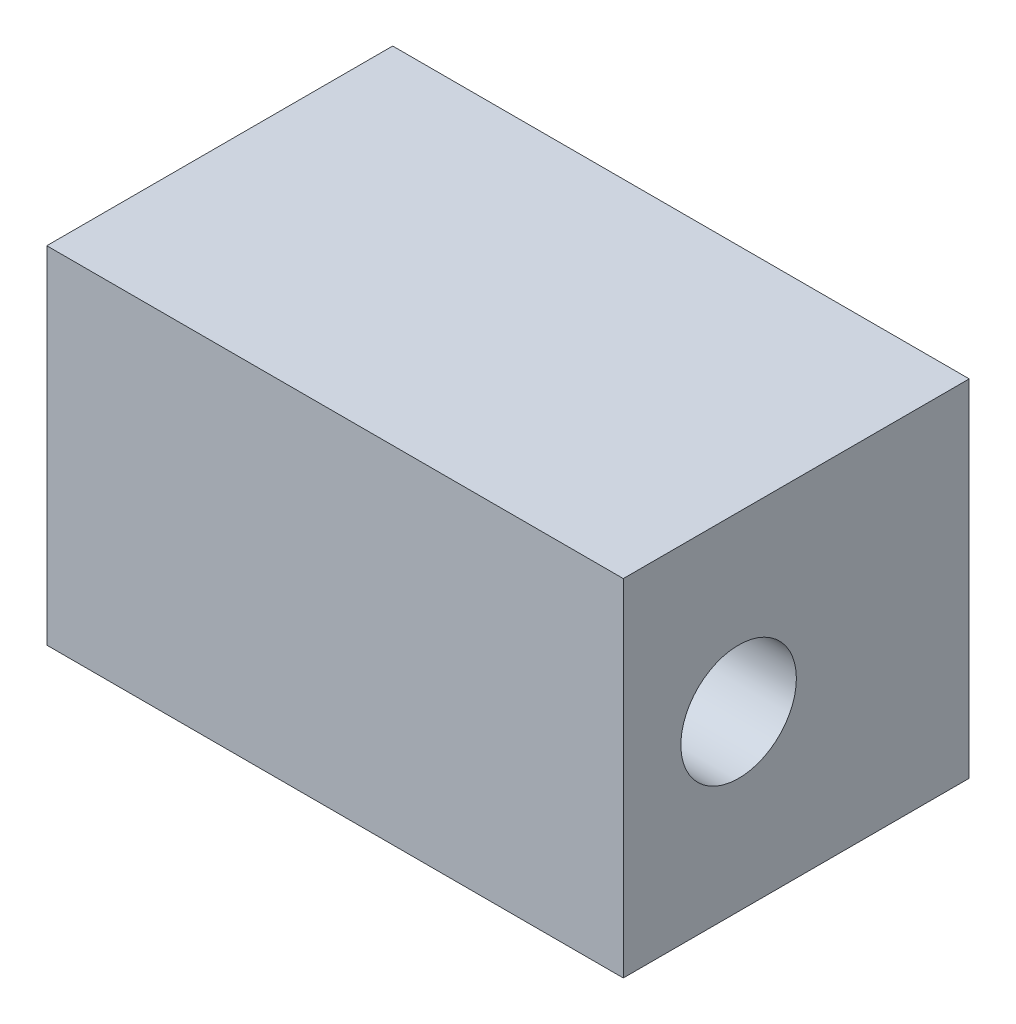
ISO-10303-21;
HEADER;
FILE_DESCRIPTION(('STEP AP214'),'2;1');
FILE_NAME('part.step','',(''),(''),'','','');
FILE_SCHEMA(('AUTOMOTIVE_DESIGN { 1 0 10303 214 1 1 1 1 }'));
ENDSEC;
DATA;
#1=APPLICATION_CONTEXT('core data for automotive mechanical design processes');
#2=APPLICATION_PROTOCOL_DEFINITION('international standard','automotive_design',2000,#1);
#3=PRODUCT_CONTEXT('',#1,'mechanical');
#4=PRODUCT('Part','Part','',(#3));
#5=PRODUCT_RELATED_PRODUCT_CATEGORY('part','',(#4));
#6=PRODUCT_DEFINITION_FORMATION('','',#4);
#7=PRODUCT_DEFINITION_CONTEXT('part definition',#1,'design');
#8=PRODUCT_DEFINITION('design','',#6,#7);
#9=PRODUCT_DEFINITION_SHAPE('','',#8);
#10=(LENGTH_UNIT() NAMED_UNIT(*) SI_UNIT(.MILLI.,.METRE.));
#11=(NAMED_UNIT(*) PLANE_ANGLE_UNIT() SI_UNIT($,.RADIAN.));
#12=(NAMED_UNIT(*) SI_UNIT($,.STERADIAN.) SOLID_ANGLE_UNIT());
#13=UNCERTAINTY_MEASURE_WITH_UNIT(LENGTH_MEASURE(1.E-05),#10,'distance_accuracy_value','');
#14=(GEOMETRIC_REPRESENTATION_CONTEXT(3) GLOBAL_UNCERTAINTY_ASSIGNED_CONTEXT((#13)) GLOBAL_UNIT_ASSIGNED_CONTEXT((#10,
#11,#12)) REPRESENTATION_CONTEXT('',''));
#15=CARTESIAN_POINT('',(0.,0.,0.));
#16=DIRECTION('',(0.,0.,1.));
#17=DIRECTION('',(1.,0.,0.));
#18=AXIS2_PLACEMENT_3D('',#15,#16,#17);
#19=CARTESIAN_POINT('',(-63.5,18.7872413793104,24.1737931034483));
#20=DIRECTION('',(0.,0.,1.));
#21=DIRECTION('',(1.,0.,0.));
#22=AXIS2_PLACEMENT_3D('',#19,#20,#21);
#23=PLANE('',#22);
#24=DIRECTION('',(0.,-1.,0.));
#25=VECTOR('',#24,1.);
#26=CARTESIAN_POINT('',(0.,18.7872413793104,24.1737931034483));
#27=LINE('',#26,#25);
#28=CARTESIAN_POINT('',(0.,18.7872413793104,24.1737931034483));
#29=VERTEX_POINT('',#28);
#30=CARTESIAN_POINT('',(0.,-19.3127586206897,24.1737931034483));
#31=VERTEX_POINT('',#30);
#32=EDGE_CURVE('E104',#29,#31,#27,.T.);
#33=ORIENTED_EDGE('',*,*,#32,.F.);
#34=DIRECTION('',(1.,0.,0.));
#35=VECTOR('',#34,1.);
#36=CARTESIAN_POINT('',(-63.5,18.7872413793104,24.1737931034483));
#37=LINE('',#36,#35);
#38=CARTESIAN_POINT('',(-63.5,18.7872413793104,24.1737931034483));
#39=VERTEX_POINT('',#38);
#40=EDGE_CURVE('E11',#39,#29,#37,.T.);
#41=ORIENTED_EDGE('',*,*,#40,.F.);
#42=DIRECTION('',(0.,-1.,0.));
#43=VECTOR('',#42,1.);
#44=CARTESIAN_POINT('',(-63.5,18.7872413793104,24.1737931034483));
#45=LINE('',#44,#43);
#46=CARTESIAN_POINT('',(-63.5,-19.3127586206897,24.1737931034483));
#47=VERTEX_POINT('',#46);
#48=EDGE_CURVE('E97',#39,#47,#45,.T.);
#49=ORIENTED_EDGE('',*,*,#48,.T.);
#50=DIRECTION('',(1.,0.,0.));
#51=VECTOR('',#50,1.);
#52=CARTESIAN_POINT('',(-63.5,-19.3127586206897,24.1737931034483));
#53=LINE('',#52,#51);
#54=EDGE_CURVE('E80',#47,#31,#53,.T.);
#55=ORIENTED_EDGE('',*,*,#54,.T.);
#56=EDGE_LOOP('',(#33,#41,#49,#55));
#57=FACE_BOUND('',#56,.T.);
#58=ADVANCED_FACE('F33',(#57),#23,.T.);
#59=CARTESIAN_POINT('',(-63.5,18.7872413793104,24.1737931034483));
#60=DIRECTION('',(0.,1.,0.));
#61=DIRECTION('',(0.,0.,1.));
#62=AXIS2_PLACEMENT_3D('',#59,#60,#61);
#63=PLANE('',#62);
#64=DIRECTION('',(0.,0.,1.));
#65=VECTOR('',#64,1.);
#66=CARTESIAN_POINT('',(0.,18.7872413793104,24.1737931034483));
#67=LINE('',#66,#65);
#68=CARTESIAN_POINT('',(0.,18.7872413793104,-13.9262068965517));
#69=VERTEX_POINT('',#68);
#70=EDGE_CURVE('E99',#69,#29,#67,.T.);
#71=ORIENTED_EDGE('',*,*,#70,.F.);
#72=DIRECTION('',(1.,0.,0.));
#73=VECTOR('',#72,1.);
#74=CARTESIAN_POINT('',(-63.5,18.7872413793104,-13.9262068965517));
#75=LINE('',#74,#73);
#76=CARTESIAN_POINT('',(-63.5,18.7872413793104,-13.9262068965517));
#77=VERTEX_POINT('',#76);
#78=EDGE_CURVE('E46',#77,#69,#75,.T.);
#79=ORIENTED_EDGE('',*,*,#78,.F.);
#80=DIRECTION('',(0.,0.,1.));
#81=VECTOR('',#80,1.);
#82=CARTESIAN_POINT('',(-63.5,18.7872413793104,24.1737931034483));
#83=LINE('',#82,#81);
#84=EDGE_CURVE('E94',#77,#39,#83,.T.);
#85=ORIENTED_EDGE('',*,*,#84,.T.);
#86=ORIENTED_EDGE('',*,*,#40,.T.);
#87=EDGE_LOOP('',(#71,#79,#85,#86));
#88=FACE_BOUND('',#87,.T.);
#89=ADVANCED_FACE('F115',(#88),#63,.T.);
#90=CARTESIAN_POINT('',(-63.5,18.7872413793104,-13.9262068965517));
#91=DIRECTION('',(0.,0.,-1.));
#92=DIRECTION('',(0.,1.,0.));
#93=AXIS2_PLACEMENT_3D('',#90,#91,#92);
#94=PLANE('',#93);
#95=CARTESIAN_POINT('',(-50.8,-0.26275862068965,-13.9262068965517));
#96=DIRECTION('',(0.,0.,-1.));
#97=DIRECTION('',(0.,1.,0.));
#98=AXIS2_PLACEMENT_3D('',#95,#96,#97);
#99=CIRCLE('',#98,0.634999999999995);
#100=CARTESIAN_POINT('',(-50.8,0.372241379310346,-13.9262068965517));
#101=VERTEX_POINT('',#100);
#102=EDGE_CURVE('E159',#101,#101,#99,.T.);
#103=ORIENTED_EDGE('',*,*,#102,.F.);
#104=EDGE_LOOP('',(#103));
#105=FACE_BOUND('',#104,.T.);
#106=CARTESIAN_POINT('',(-25.4,-0.26275862068965,-13.9262068965517));
#107=DIRECTION('',(0.,0.,-1.));
#108=DIRECTION('',(0.,1.,0.));
#109=AXIS2_PLACEMENT_3D('',#106,#107,#108);
#110=CIRCLE('',#109,2.0193);
#111=CARTESIAN_POINT('',(-25.4,1.75654137931035,-13.9262068965517));
#112=VERTEX_POINT('',#111);
#113=EDGE_CURVE('E162',#112,#112,#110,.T.);
#114=ORIENTED_EDGE('',*,*,#113,.F.);
#115=EDGE_LOOP('',(#114));
#116=FACE_BOUND('',#115,.T.);
#117=DIRECTION('',(0.,1.,0.));
#118=VECTOR('',#117,1.);
#119=CARTESIAN_POINT('',(0.,18.7872413793104,-13.9262068965517));
#120=LINE('',#119,#118);
#121=CARTESIAN_POINT('',(0.,-19.3127586206897,-13.9262068965517));
#122=VERTEX_POINT('',#121);
#123=EDGE_CURVE('E88',#122,#69,#120,.T.);
#124=ORIENTED_EDGE('',*,*,#123,.F.);
#125=DIRECTION('',(1.,0.,0.));
#126=VECTOR('',#125,1.);
#127=CARTESIAN_POINT('',(-63.5,-19.3127586206897,-13.9262068965517));
#128=LINE('',#127,#126);
#129=CARTESIAN_POINT('',(-63.5,-19.3127586206897,-13.9262068965517));
#130=VERTEX_POINT('',#129);
#131=EDGE_CURVE('E83',#130,#122,#128,.T.);
#132=ORIENTED_EDGE('',*,*,#131,.F.);
#133=DIRECTION('',(0.,1.,0.));
#134=VECTOR('',#133,1.);
#135=CARTESIAN_POINT('',(-63.5,18.7872413793104,-13.9262068965517));
#136=LINE('',#135,#134);
#137=EDGE_CURVE('E86',#130,#77,#136,.T.);
#138=ORIENTED_EDGE('',*,*,#137,.T.);
#139=ORIENTED_EDGE('',*,*,#78,.T.);
#140=EDGE_LOOP('',(#124,#132,#138,#139));
#141=FACE_BOUND('',#140,.T.);
#142=ADVANCED_FACE('F85',(#105,#116,#141),#94,.T.);
#143=CARTESIAN_POINT('',(-63.5,-19.3127586206897,24.1737931034483));
#144=DIRECTION('',(0.,-1.,0.));
#145=DIRECTION('',(0.,0.,-1.));
#146=AXIS2_PLACEMENT_3D('',#143,#144,#145);
#147=PLANE('',#146);
#148=DIRECTION('',(0.,0.,-1.));
#149=VECTOR('',#148,1.);
#150=CARTESIAN_POINT('',(0.,-19.3127586206897,24.1737931034483));
#151=LINE('',#150,#149);
#152=EDGE_CURVE('E107',#31,#122,#151,.T.);
#153=ORIENTED_EDGE('',*,*,#152,.F.);
#154=ORIENTED_EDGE('',*,*,#54,.F.);
#155=DIRECTION('',(0.,0.,-1.));
#156=VECTOR('',#155,1.);
#157=CARTESIAN_POINT('',(-63.5,-19.3127586206897,24.1737931034483));
#158=LINE('',#157,#156);
#159=EDGE_CURVE('E93',#47,#130,#158,.T.);
#160=ORIENTED_EDGE('',*,*,#159,.T.);
#161=ORIENTED_EDGE('',*,*,#131,.T.);
#162=EDGE_LOOP('',(#153,#154,#160,#161));
#163=FACE_BOUND('',#162,.T.);
#164=ADVANCED_FACE('F96',(#163),#147,.T.);
#165=CARTESIAN_POINT('',(-63.5,0.,0.));
#166=DIRECTION('',(1.,0.,0.));
#167=DIRECTION('',(0.,0.,-1.));
#168=AXIS2_PLACEMENT_3D('',#165,#166,#167);
#169=PLANE('',#168);
#170=ORIENTED_EDGE('',*,*,#48,.F.);
#171=ORIENTED_EDGE('',*,*,#84,.F.);
#172=ORIENTED_EDGE('',*,*,#137,.F.);
#173=ORIENTED_EDGE('',*,*,#159,.F.);
#174=EDGE_LOOP('',(#170,#171,#172,#173));
#175=FACE_BOUND('',#174,.T.);
#176=ADVANCED_FACE('F92',(#175),#169,.F.);
#177=CARTESIAN_POINT('',(0.,0.,0.));
#178=DIRECTION('',(1.,0.,0.));
#179=DIRECTION('',(0.,0.,-1.));
#180=AXIS2_PLACEMENT_3D('',#177,#178,#179);
#181=PLANE('',#180);
#182=CARTESIAN_POINT('',(0.,-0.262758620689651,11.4737931034483));
#183=DIRECTION('',(1.,0.,0.));
#184=DIRECTION('',(0.,0.,-1.));
#185=AXIS2_PLACEMENT_3D('',#182,#183,#184);
#186=CIRCLE('',#185,6.3627);
#187=CARTESIAN_POINT('',(0.,-0.262758620689651,5.11109310344827));
#188=VERTEX_POINT('',#187);
#189=EDGE_CURVE('E169',#188,#188,#186,.T.);
#190=ORIENTED_EDGE('',*,*,#189,.F.);
#191=EDGE_LOOP('',(#190));
#192=FACE_BOUND('',#191,.T.);
#193=ORIENTED_EDGE('',*,*,#32,.T.);
#194=ORIENTED_EDGE('',*,*,#152,.T.);
#195=ORIENTED_EDGE('',*,*,#123,.T.);
#196=ORIENTED_EDGE('',*,*,#70,.T.);
#197=EDGE_LOOP('',(#193,#194,#195,#196));
#198=FACE_BOUND('',#197,.T.);
#199=ADVANCED_FACE('F114',(#192,#198),#181,.T.);
#200=CARTESIAN_POINT('',(-57.15,-0.262758620689651,11.4737931034483));
#201=DIRECTION('',(1.,0.,0.));
#202=DIRECTION('',(0.,0.,-1.));
#203=AXIS2_PLACEMENT_3D('',#200,#201,#202);
#204=CYLINDRICAL_SURFACE('',#203,6.3627);
#205=CARTESIAN_POINT('',(-51.435,-0.262758620689651,5.11109310344827));
#206=CARTESIAN_POINT('',(-51.4349984593519,-0.22718531741803,5.1110935121615));
#207=CARTESIAN_POINT('',(-51.4320006605201,-0.191588485909958,5.11139460447675));
#208=CARTESIAN_POINT('',(-51.4200870940284,-0.121381679873996,5.11256676873353));
#209=CARTESIAN_POINT('',(-51.4111648040431,-0.086772836877961,5.11343846884728));
#210=CARTESIAN_POINT('',(-51.3876645609306,-0.0195688389823599,5.11565344802345));
#211=CARTESIAN_POINT('',(-51.3730900207176,0.0130275173452061,5.11699644246475));
#212=CARTESIAN_POINT('',(-51.3387056115521,0.0753041412629182,5.12000383429252));
#213=CARTESIAN_POINT('',(-51.3188967846907,0.104984987688555,5.12166816768606));
#214=CARTESIAN_POINT('',(-51.2745298778171,0.16070158700757,5.12513846873118));
#215=CARTESIAN_POINT('',(-51.249956863572,0.186725421884826,5.12694487085411));
#216=CARTESIAN_POINT('',(-51.1967909649398,0.234286847589165,5.13049212310695));
#217=CARTESIAN_POINT('',(-51.1681978948417,0.255824231045478,5.13223297020376));
#218=CARTESIAN_POINT('',(-51.1077290008892,0.293843552132584,5.13545645752063));
#219=CARTESIAN_POINT('',(-51.0758463685647,0.310314711979226,5.13693854440455));
#220=CARTESIAN_POINT('',(-51.0097505946942,0.337665208665084,5.13947133303224));
#221=CARTESIAN_POINT('',(-50.9755375105361,0.348544683144192,5.14052204539419));
#222=CARTESIAN_POINT('',(-50.9058735089227,0.364367666735934,5.14206920280899));
#223=CARTESIAN_POINT('',(-50.8704271207284,0.369330933494784,5.14256749232968));
#224=CARTESIAN_POINT('',(-50.7992012007361,0.373241686631476,5.14295911647546));
#225=CARTESIAN_POINT('',(-50.7634216776864,0.372189330537801,5.14285246694181));
#226=CARTESIAN_POINT('',(-50.6926813234981,0.36411499623959,5.14204794690587));
#227=CARTESIAN_POINT('',(-50.6577180024626,0.357114589568837,5.14135221284231));
#228=CARTESIAN_POINT('',(-50.5894650005263,0.337376434032649,5.13945125354522));
#229=CARTESIAN_POINT('',(-50.5561753421597,0.324638607941274,5.13824602145384));
#230=CARTESIAN_POINT('',(-50.4921464868271,0.293763378478992,5.13545940816187));
#231=CARTESIAN_POINT('',(-50.4614119356968,0.275616403136978,5.13387736115938));
#232=CARTESIAN_POINT('',(-50.4034165742976,0.23444487992671,5.1305159401346));
#233=CARTESIAN_POINT('',(-50.376155865329,0.211420189872237,5.12873656036074));
#234=CARTESIAN_POINT('',(-50.3257566674781,0.161026334848828,5.12517144698783));
#235=CARTESIAN_POINT('',(-50.3026368020049,0.133638539952481,5.12338571979104));
#236=CARTESIAN_POINT('',(-50.2613199208147,0.0753606090974232,5.12001649785384));
#237=CARTESIAN_POINT('',(-50.2431229105837,0.0444704692357777,5.11843300333881));
#238=CARTESIAN_POINT('',(-50.2121690385572,-0.0199481862907417,5.11564614683699));
#239=CARTESIAN_POINT('',(-50.1994131201194,-0.053477158274607,5.11444285077706));
#240=CARTESIAN_POINT('',(-50.1797171667521,-0.122215636316391,5.11255264591087));
#241=CARTESIAN_POINT('',(-50.1727769585964,-0.157425092286604,5.11186572172407));
#242=CARTESIAN_POINT('',(-50.1649330554506,-0.228363789239891,5.11108763503931));
#243=CARTESIAN_POINT('',(-50.1640036611704,-0.264090161915775,5.11099393623706));
#244=CARTESIAN_POINT('',(-50.1681402716038,-0.335190165078745,5.11140605720059));
#245=CARTESIAN_POINT('',(-50.1732061956487,-0.370563800305561,5.11191186889979));
#246=CARTESIAN_POINT('',(-50.1891683197489,-0.43988003685712,5.11346454578683));
#247=CARTESIAN_POINT('',(-50.200052488429,-0.473825435892277,5.1145102943036));
#248=CARTESIAN_POINT('',(-50.22732977663,-0.539408575452137,5.11702552292359));
#249=CARTESIAN_POINT('',(-50.2437230191958,-0.571046264415038,5.11849501249094));
#250=CARTESIAN_POINT('',(-50.2816168563573,-0.631232109878783,5.12169966239188));
#251=CARTESIAN_POINT('',(-50.3031343374682,-0.659769587246886,5.12343569422751));
#252=CARTESIAN_POINT('',(-50.3506416343687,-0.712836839832267,5.12697582409147));
#253=CARTESIAN_POINT('',(-50.3766315619554,-0.737366514837136,5.1287799238204));
#254=CARTESIAN_POINT('',(-50.4324581182366,-0.781811071884677,5.13226048467252));
#255=CARTESIAN_POINT('',(-50.4623082077936,-0.801709088786604,5.13393646485304));
#256=CARTESIAN_POINT('',(-50.524941351044,-0.836209562541787,5.13696372934451));
#257=CARTESIAN_POINT('',(-50.5577243647607,-0.850812091560448,5.13831501808017));
#258=CARTESIAN_POINT('',(-50.6252349035787,-0.874278837507182,5.14053691404486));
#259=CARTESIAN_POINT('',(-50.6599589104438,-0.883153093025458,5.14140836178153));
#260=CARTESIAN_POINT('',(-50.7304132682207,-0.894943956799909,5.14257452750314));
#261=CARTESIAN_POINT('',(-50.7661435903663,-0.897860735179631,5.14286926195687));
#262=CARTESIAN_POINT('',(-50.8374286958126,-0.897651491607522,5.14284828751967));
#263=CARTESIAN_POINT('',(-50.8729835606353,-0.894551962881608,5.14253525497134));
#264=CARTESIAN_POINT('',(-50.9430648052441,-0.882453633857394,5.1413397242343));
#265=CARTESIAN_POINT('',(-50.9775911838671,-0.873454826888061,5.14045722540162));
#266=CARTESIAN_POINT('',(-51.0446352068748,-0.849820685165759,5.1382229401152));
#267=CARTESIAN_POINT('',(-51.0771531260717,-0.83518612352984,5.13687121803237));
#268=CARTESIAN_POINT('',(-51.1392752810858,-0.800698633066321,5.13385066273333));
#269=CARTESIAN_POINT('',(-51.1688795335985,-0.780845734142467,5.13218183133434));
#270=CARTESIAN_POINT('',(-51.2244697675116,-0.736385634035782,5.1287062926183));
#271=CARTESIAN_POINT('',(-51.2504399279607,-0.711758694027042,5.12689903239556));
#272=CARTESIAN_POINT('',(-51.2978907960524,-0.658488585814825,5.12335531613756));
#273=CARTESIAN_POINT('',(-51.3193704266856,-0.629844456874227,5.12161887716828));
#274=CARTESIAN_POINT('',(-51.3572728328861,-0.569274522953876,5.11840793146543));
#275=CARTESIAN_POINT('',(-51.3736827833627,-0.53734066321409,5.11693409296748));
#276=CARTESIAN_POINT('',(-51.4008857116148,-0.471176428395024,5.11442168525382));
#277=CARTESIAN_POINT('',(-51.41168502414,-0.43694869277321,5.11338262540588));
#278=CARTESIAN_POINT('',(-51.4246665742685,-0.379232355537716,5.11211800252294));
#279=CARTESIAN_POINT('',(-51.4285363160874,-0.356112725949847,5.11173545705823));
#280=CARTESIAN_POINT('',(-51.433703530788,-0.309585002516606,5.11122287350883));
#281=CARTESIAN_POINT('',(-51.4350010142252,-0.286176909855375,5.11109283438795));
#282=CARTESIAN_POINT('',(-51.435,-0.262758620689651,5.11109310344827));
#283=B_SPLINE_CURVE_WITH_KNOTS('',3,(#205,#206,#207,#208,#209,#210,#211,#212,#213,#214,#215,
#216,#217,#218,#219,#220,#221,#222,#223,#224,#225,#226,#227,#228,#229,#230,#231,#232,#233,#234,
#235,#236,#237,#238,#239,#240,#241,#242,#243,#244,#245,#246,#247,#248,#249,#250,#251,#252,#253,
#254,#255,#256,#257,#258,#259,#260,#261,#262,#263,#264,#265,#266,#267,#268,#269,#270,#271,#272,
#273,#274,#275,#276,#277,#278,#279,#280,#281,#282),.UNSPECIFIED.,.T.,.F.,(4,2,2,2,2,2,2,2,2,2,2,
2,2,2,2,2,2,2,2,2,2,2,2,2,2,2,2,2,2,2,2,2,2,2,2,2,2,2,4),(0.,0.106634395108369,
0.213386380047292,0.320074006631096,0.4267404088201,0.533746746695514,0.640758029473539,
0.747995416023433,0.855230162787937,0.962105778186656,1.06897859489325,1.17546546692549,
1.28195377231895,1.38863164841706,1.49531263462148,1.60246198684009,1.70961145846469,
1.8167794997527,1.92394434883345,2.03065070901451,2.13735563344585,2.24384075468783,
2.35032825442788,2.45717165329726,2.5640177233054,2.67124696688065,2.77847474911132,
2.88551410470256,2.99255040360237,3.09911642989957,3.20568257670417,3.31223410988944,
3.41878503249315,3.52578627876583,3.6328131588666,3.74010861552162,3.84728266439215,
3.91748152470618,3.98768009694988),.UNSPECIFIED.);
#284=CARTESIAN_POINT('',(-51.435,-0.262758620689651,5.11109310344827));
#285=VERTEX_POINT('',#284);
#286=EDGE_CURVE('E36',#285,#285,#283,.T.);
#287=ORIENTED_EDGE('',*,*,#286,.T.);
#288=EDGE_LOOP('',(#287));
#289=FACE_BOUND('',#288,.T.);
#290=CARTESIAN_POINT('',(-57.15,-0.262758620689651,11.4737931034483));
#291=DIRECTION('',(1.,0.,0.));
#292=DIRECTION('',(0.,0.,-1.));
#293=AXIS2_PLACEMENT_3D('',#290,#291,#292);
#294=CIRCLE('',#293,6.3627);
#295=CARTESIAN_POINT('',(-57.15,-0.262758620689651,5.11109310344827));
#296=VERTEX_POINT('',#295);
#297=EDGE_CURVE('E108',#296,#296,#294,.T.);
#298=ORIENTED_EDGE('',*,*,#297,.F.);
#299=EDGE_LOOP('',(#298));
#300=FACE_BOUND('',#299,.T.);
#301=ORIENTED_EDGE('',*,*,#189,.T.);
#302=EDGE_LOOP('',(#301));
#303=FACE_BOUND('',#302,.T.);
#304=ADVANCED_FACE('F133',(#289,#300,#303),#204,.F.);
#305=CARTESIAN_POINT('',(-57.15,-0.262758620689651,11.4737931034483));
#306=DIRECTION('',(1.,0.,0.));
#307=DIRECTION('',(0.,0.,-1.));
#308=AXIS2_PLACEMENT_3D('',#305,#306,#307);
#309=PLANE('',#308);
#310=ORIENTED_EDGE('',*,*,#297,.T.);
#311=EDGE_LOOP('',(#310));
#312=FACE_BOUND('',#311,.T.);
#313=ADVANCED_FACE('F138',(#312),#309,.T.);
#314=CARTESIAN_POINT('',(-25.4,-0.262758620689651,-1.22620689655172));
#315=DIRECTION('',(0.,0.,-1.));
#316=DIRECTION('',(0.,1.,0.));
#317=AXIS2_PLACEMENT_3D('',#314,#315,#316);
#318=CYLINDRICAL_SURFACE('',#317,2.0193);
#319=CARTESIAN_POINT('',(-25.4,-0.262758620689651,-1.22620689655172));
#320=DIRECTION('',(0.,0.,-1.));
#321=DIRECTION('',(0.,1.,0.));
#322=AXIS2_PLACEMENT_3D('',#319,#320,#321);
#323=CIRCLE('',#322,2.0193);
#324=CARTESIAN_POINT('',(-25.4,1.75654137931035,-1.22620689655172));
#325=VERTEX_POINT('',#324);
#326=EDGE_CURVE('E164',#325,#325,#323,.T.);
#327=ORIENTED_EDGE('',*,*,#326,.F.);
#328=EDGE_LOOP('',(#327));
#329=FACE_BOUND('',#328,.T.);
#330=ORIENTED_EDGE('',*,*,#113,.T.);
#331=EDGE_LOOP('',(#330));
#332=FACE_BOUND('',#331,.T.);
#333=ADVANCED_FACE('F142',(#329,#332),#318,.F.);
#334=CARTESIAN_POINT('',(-25.4,-0.262758620689651,-1.22620689655172));
#335=DIRECTION('',(0.,0.,-1.));
#336=DIRECTION('',(0.,1.,0.));
#337=AXIS2_PLACEMENT_3D('',#334,#335,#336);
#338=PLANE('',#337);
#339=ORIENTED_EDGE('',*,*,#326,.T.);
#340=EDGE_LOOP('',(#339));
#341=FACE_BOUND('',#340,.T.);
#342=ADVANCED_FACE('F146',(#341),#338,.T.);
#343=CARTESIAN_POINT('',(-50.8,-0.262758620689652,8.93379310344829));
#344=DIRECTION('',(0.,0.,-1.));
#345=DIRECTION('',(0.,1.,0.));
#346=AXIS2_PLACEMENT_3D('',#343,#344,#345);
#347=CYLINDRICAL_SURFACE('',#346,0.634999999999995);
#348=ORIENTED_EDGE('',*,*,#102,.T.);
#349=EDGE_LOOP('',(#348));
#350=FACE_BOUND('',#349,.T.);
#351=ORIENTED_EDGE('',*,*,#286,.F.);
#352=EDGE_LOOP('',(#351));
#353=FACE_BOUND('',#352,.T.);
#354=ADVANCED_FACE('F149',(#350,#353),#347,.F.);
#355=CLOSED_SHELL('',(#58,#89,#142,#164,#176,#199,#304,#313,#333,#342,#354));
#356=MANIFOLD_SOLID_BREP('B2',#355);
#357=ADVANCED_BREP_SHAPE_REPRESENTATION('',(#18,#356),#14);
#358=SHAPE_DEFINITION_REPRESENTATION(#9,#357);
ENDSEC;
END-ISO-10303-21;
